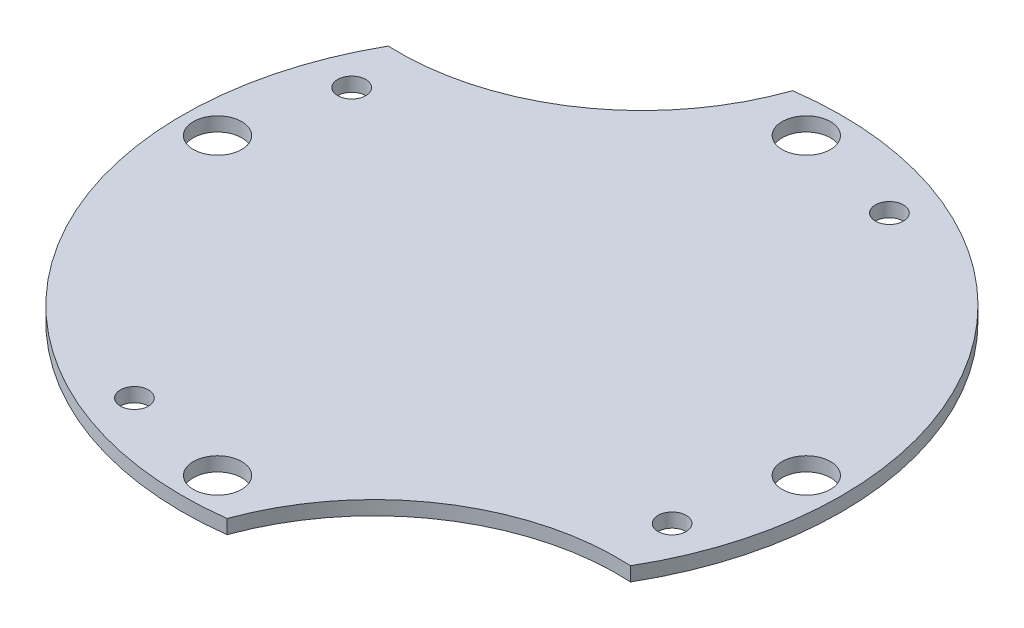
ISO-10303-21;
HEADER;
FILE_DESCRIPTION(('STEP AP214'),'2;1');
FILE_NAME('part.step','',(''),(''),'','','');
FILE_SCHEMA(('AUTOMOTIVE_DESIGN { 1 0 10303 214 1 1 1 1 }'));
ENDSEC;
DATA;
#1=APPLICATION_CONTEXT('core data for automotive mechanical design processes');
#2=APPLICATION_PROTOCOL_DEFINITION('international standard','automotive_design',2000,#1);
#3=PRODUCT_CONTEXT('',#1,'mechanical');
#4=PRODUCT('Part','Part','',(#3));
#5=PRODUCT_RELATED_PRODUCT_CATEGORY('part','',(#4));
#6=PRODUCT_DEFINITION_FORMATION('','',#4);
#7=PRODUCT_DEFINITION_CONTEXT('part definition',#1,'design');
#8=PRODUCT_DEFINITION('design','',#6,#7);
#9=PRODUCT_DEFINITION_SHAPE('','',#8);
#10=(LENGTH_UNIT() NAMED_UNIT(*) SI_UNIT(.MILLI.,.METRE.));
#11=(NAMED_UNIT(*) PLANE_ANGLE_UNIT() SI_UNIT($,.RADIAN.));
#12=(NAMED_UNIT(*) SI_UNIT($,.STERADIAN.) SOLID_ANGLE_UNIT());
#13=UNCERTAINTY_MEASURE_WITH_UNIT(LENGTH_MEASURE(1.E-05),#10,'distance_accuracy_value','');
#14=(GEOMETRIC_REPRESENTATION_CONTEXT(3) GLOBAL_UNCERTAINTY_ASSIGNED_CONTEXT((#13)) GLOBAL_UNIT_ASSIGNED_CONTEXT((#10,
#11,#12)) REPRESENTATION_CONTEXT('',''));
#15=CARTESIAN_POINT('',(0.,0.,0.));
#16=DIRECTION('',(0.,0.,1.));
#17=DIRECTION('',(1.,0.,0.));
#18=AXIS2_PLACEMENT_3D('',#15,#16,#17);
#19=CARTESIAN_POINT('',(9.03512257305145,1.6,-0.496100850031172));
#20=DIRECTION('',(0.,-1.,0.));
#21=DIRECTION('',(0.,0.,-1.));
#22=AXIS2_PLACEMENT_3D('',#19,#20,#21);
#23=CYLINDRICAL_SURFACE('',#22,37.5);
#24=CARTESIAN_POINT('',(9.03512257305145,0.,-0.496100850031172));
#25=DIRECTION('',(0.,1.,0.));
#26=DIRECTION('',(0.,0.,1.));
#27=AXIS2_PLACEMENT_3D('',#24,#25,#26);
#28=CIRCLE('',#27,37.5);
#29=CARTESIAN_POINT('',(41.4282299278979,0.,18.3966648526761));
#30=VERTEX_POINT('',#29);
#31=CARTESIAN_POINT('',(3.83543220498433,0.,-37.63386088044));
#32=VERTEX_POINT('',#31);
#33=EDGE_CURVE('E100',#30,#32,#28,.T.);
#34=ORIENTED_EDGE('',*,*,#33,.T.);
#35=DIRECTION('',(0.,1.,0.));
#36=VECTOR('',#35,1.);
#37=CARTESIAN_POINT('',(3.83543220498434,-3.4,-37.63386088044));
#38=LINE('',#37,#36);
#39=CARTESIAN_POINT('',(3.83543220498433,1.6,-37.63386088044));
#40=VERTEX_POINT('',#39);
#41=EDGE_CURVE('E54',#32,#40,#38,.T.);
#42=ORIENTED_EDGE('',*,*,#41,.T.);
#43=CARTESIAN_POINT('',(9.03512257305145,1.6,-0.496100850031172));
#44=DIRECTION('',(0.,1.,0.));
#45=DIRECTION('',(0.,0.,1.));
#46=AXIS2_PLACEMENT_3D('',#43,#44,#45);
#47=CIRCLE('',#46,37.5);
#48=CARTESIAN_POINT('',(41.4282299278979,1.6,18.3966648526761));
#49=VERTEX_POINT('',#48);
#50=EDGE_CURVE('E99',#49,#40,#47,.T.);
#51=ORIENTED_EDGE('',*,*,#50,.F.);
#52=DIRECTION('',(0.,1.,0.));
#53=VECTOR('',#52,1.);
#54=CARTESIAN_POINT('',(41.4282299278979,-3.4,18.3966648526761));
#55=LINE('',#54,#53);
#56=EDGE_CURVE('E80',#49,#30,#55,.F.);
#57=ORIENTED_EDGE('',*,*,#56,.T.);
#58=EDGE_LOOP('',(#34,#42,#51,#57));
#59=FACE_BOUND('',#58,.T.);
#60=ADVANCED_FACE('F39',(#59),#23,.T.);
#61=CARTESIAN_POINT('',(-23.5667800019792,1.6,-19.0262370742528));
#62=VERTEX_POINT('',#61);
#63=CARTESIAN_POINT('',(13.8200934966106,1.6,36.697367034272));
#64=VERTEX_POINT('',#63);
#65=EDGE_CURVE('E91',#62,#64,#47,.T.);
#66=ORIENTED_EDGE('',*,*,#65,.F.);
#67=DIRECTION('',(0.,1.,0.));
#68=VECTOR('',#67,1.);
#69=CARTESIAN_POINT('',(-23.5667800019792,-3.4,-19.0262370742528));
#70=LINE('',#69,#68);
#71=CARTESIAN_POINT('',(-23.5667800019792,0.,-19.0262370742528));
#72=VERTEX_POINT('',#71);
#73=EDGE_CURVE('E94',#62,#72,#70,.F.);
#74=ORIENTED_EDGE('',*,*,#73,.T.);
#75=CARTESIAN_POINT('',(13.8200934966106,0.,36.697367034272));
#76=VERTEX_POINT('',#75);
#77=EDGE_CURVE('E93',#72,#76,#28,.T.);
#78=ORIENTED_EDGE('',*,*,#77,.T.);
#79=DIRECTION('',(0.,1.,0.));
#80=VECTOR('',#79,1.);
#81=CARTESIAN_POINT('',(13.8200934966106,-3.4,36.697367034272));
#82=LINE('',#81,#80);
#83=EDGE_CURVE('E61',#76,#64,#82,.T.);
#84=ORIENTED_EDGE('',*,*,#83,.T.);
#85=EDGE_LOOP('',(#66,#74,#78,#84));
#86=FACE_BOUND('',#85,.T.);
#87=ADVANCED_FACE('F41',(#86),#23,.T.);
#88=CARTESIAN_POINT('',(9.03512257305145,1.6,-0.496100850031172));
#89=DIRECTION('',(0.,1.,0.));
#90=DIRECTION('',(0.,0.,1.));
#91=AXIS2_PLACEMENT_3D('',#88,#89,#90);
#92=PLANE('',#91);
#93=CARTESIAN_POINT('',(-22.3602061702579,1.6,-46.7299171337358));
#94=DIRECTION('',(0.,1.,0.));
#95=DIRECTION('',(0.,0.,1.));
#96=AXIS2_PLACEMENT_3D('',#93,#94,#95);
#97=CIRCLE('',#96,27.7299424674771);
#98=EDGE_CURVE('E85',#62,#40,#97,.T.);
#99=ORIENTED_EDGE('',*,*,#98,.F.);
#100=ORIENTED_EDGE('',*,*,#65,.T.);
#101=CARTESIAN_POINT('',(39.9126041477574,1.6,46.0851568257714));
#102=DIRECTION('',(0.,1.,0.));
#103=DIRECTION('',(0.,0.,-1.));
#104=AXIS2_PLACEMENT_3D('',#101,#102,#103);
#105=CIRCLE('',#104,27.7299424674771);
#106=EDGE_CURVE('E77',#49,#64,#105,.T.);
#107=ORIENTED_EDGE('',*,*,#106,.F.);
#108=ORIENTED_EDGE('',*,*,#50,.T.);
#109=EDGE_LOOP('',(#99,#100,#107,#108));
#110=FACE_BOUND('',#109,.T.);
#111=CARTESIAN_POINT('',(9.03512257301126,1.6,-33.9910252257756));
#112=DIRECTION('',(0.,1.,0.));
#113=DIRECTION('',(0.,0.,1.));
#114=AXIS2_PLACEMENT_3D('',#111,#112,#113);
#115=CIRCLE('',#114,2.75);
#116=CARTESIAN_POINT('',(9.03512257301126,1.6,-31.2410252257756));
#117=VERTEX_POINT('',#116);
#118=EDGE_CURVE('E150',#117,#117,#115,.T.);
#119=ORIENTED_EDGE('',*,*,#118,.F.);
#120=EDGE_LOOP('',(#119));
#121=FACE_BOUND('',#120,.T.);
#122=CARTESIAN_POINT('',(42.5300469487959,1.6,-0.49610085007125));
#123=DIRECTION('',(0.,1.,0.));
#124=DIRECTION('',(0.,0.,1.));
#125=AXIS2_PLACEMENT_3D('',#122,#123,#124);
#126=CIRCLE('',#125,2.75);
#127=CARTESIAN_POINT('',(42.5300469487959,1.6,2.25389914992875));
#128=VERTEX_POINT('',#127);
#129=EDGE_CURVE('E153',#128,#128,#126,.T.);
#130=ORIENTED_EDGE('',*,*,#129,.F.);
#131=EDGE_LOOP('',(#130));
#132=FACE_BOUND('',#131,.T.);
#133=CARTESIAN_POINT('',(9.03512257309142,1.6,32.9988235257133));
#134=DIRECTION('',(0.,1.,0.));
#135=DIRECTION('',(0.,0.,1.));
#136=AXIS2_PLACEMENT_3D('',#133,#134,#135);
#137=CIRCLE('',#136,2.75);
#138=CARTESIAN_POINT('',(9.03512257309142,1.6,35.7488235257133));
#139=VERTEX_POINT('',#138);
#140=EDGE_CURVE('E156',#139,#139,#137,.T.);
#141=ORIENTED_EDGE('',*,*,#140,.F.);
#142=EDGE_LOOP('',(#141));
#143=FACE_BOUND('',#142,.T.);
#144=CARTESIAN_POINT('',(-3.3268950097145,1.6,30.0946865930768));
#145=DIRECTION('',(0.,1.,0.));
#146=DIRECTION('',(0.,0.,1.));
#147=AXIS2_PLACEMENT_3D('',#144,#145,#146);
#148=CIRCLE('',#147,1.6);
#149=CARTESIAN_POINT('',(-3.3268950097145,1.6,31.6946865930768));
#150=VERTEX_POINT('',#149);
#151=EDGE_CURVE('E144',#150,#150,#148,.T.);
#152=ORIENTED_EDGE('',*,*,#151,.F.);
#153=EDGE_LOOP('',(#152));
#154=FACE_BOUND('',#153,.T.);
#155=CARTESIAN_POINT('',(-21.5556648700565,1.6,-12.8581184327971));
#156=DIRECTION('',(0.,1.,0.));
#157=DIRECTION('',(0.,0.,1.));
#158=AXIS2_PLACEMENT_3D('',#155,#156,#157);
#159=CIRCLE('',#158,1.6);
#160=CARTESIAN_POINT('',(-21.5556648700565,1.6,-11.2581184327971));
#161=VERTEX_POINT('',#160);
#162=EDGE_CURVE('E141',#161,#161,#159,.T.);
#163=ORIENTED_EDGE('',*,*,#162,.F.);
#164=EDGE_LOOP('',(#163));
#165=FACE_BOUND('',#164,.T.);
#166=CARTESIAN_POINT('',(21.3971401558174,1.6,-31.0868882931391));
#167=DIRECTION('',(0.,1.,0.));
#168=DIRECTION('',(0.,0.,1.));
#169=AXIS2_PLACEMENT_3D('',#166,#167,#168);
#170=CIRCLE('',#169,1.6);
#171=CARTESIAN_POINT('',(21.3971401558174,1.6,-29.4868882931392));
#172=VERTEX_POINT('',#171);
#173=EDGE_CURVE('E145',#172,#172,#170,.T.);
#174=ORIENTED_EDGE('',*,*,#173,.F.);
#175=EDGE_LOOP('',(#174));
#176=FACE_BOUND('',#175,.T.);
#177=CARTESIAN_POINT('',(39.6259100161594,1.6,11.8659167327348));
#178=DIRECTION('',(0.,1.,0.));
#179=DIRECTION('',(0.,0.,1.));
#180=AXIS2_PLACEMENT_3D('',#177,#178,#179);
#181=CIRCLE('',#180,1.6);
#182=CARTESIAN_POINT('',(39.6259100161594,1.6,13.4659167327348));
#183=VERTEX_POINT('',#182);
#184=EDGE_CURVE('E140',#183,#183,#181,.T.);
#185=ORIENTED_EDGE('',*,*,#184,.F.);
#186=EDGE_LOOP('',(#185));
#187=FACE_BOUND('',#186,.T.);
#188=CARTESIAN_POINT('',(-24.459801802693,1.6,-0.49610084999086));
#189=DIRECTION('',(0.,1.,0.));
#190=DIRECTION('',(0.,0.,1.));
#191=AXIS2_PLACEMENT_3D('',#188,#189,#190);
#192=CIRCLE('',#191,2.75);
#193=CARTESIAN_POINT('',(-24.459801802693,1.6,2.25389915000914));
#194=VERTEX_POINT('',#193);
#195=EDGE_CURVE('E105',#194,#194,#192,.T.);
#196=ORIENTED_EDGE('',*,*,#195,.F.);
#197=EDGE_LOOP('',(#196));
#198=FACE_BOUND('',#197,.T.);
#199=ADVANCED_FACE('F97',(#110,#121,#132,#143,#154,#165,#176,#187,#198),#92,.T.);
#200=CARTESIAN_POINT('',(9.03512257305145,0.,-0.496100850031172));
#201=DIRECTION('',(0.,1.,0.));
#202=DIRECTION('',(0.,0.,1.));
#203=AXIS2_PLACEMENT_3D('',#200,#201,#202);
#204=PLANE('',#203);
#205=CARTESIAN_POINT('',(9.03512257301126,0.,-33.9910252257756));
#206=DIRECTION('',(0.,1.,0.));
#207=DIRECTION('',(0.,0.,1.));
#208=AXIS2_PLACEMENT_3D('',#205,#206,#207);
#209=CIRCLE('',#208,2.75);
#210=CARTESIAN_POINT('',(9.03512257301126,0.,-31.2410252257756));
#211=VERTEX_POINT('',#210);
#212=EDGE_CURVE('E108',#211,#211,#209,.T.);
#213=ORIENTED_EDGE('',*,*,#212,.T.);
#214=EDGE_LOOP('',(#213));
#215=FACE_BOUND('',#214,.T.);
#216=CARTESIAN_POINT('',(42.5300469487959,0.,-0.49610085007125));
#217=DIRECTION('',(0.,1.,0.));
#218=DIRECTION('',(0.,0.,1.));
#219=AXIS2_PLACEMENT_3D('',#216,#217,#218);
#220=CIRCLE('',#219,2.75);
#221=CARTESIAN_POINT('',(42.5300469487959,0.,2.25389914992875));
#222=VERTEX_POINT('',#221);
#223=EDGE_CURVE('E127',#222,#222,#220,.T.);
#224=ORIENTED_EDGE('',*,*,#223,.T.);
#225=EDGE_LOOP('',(#224));
#226=FACE_BOUND('',#225,.T.);
#227=CARTESIAN_POINT('',(9.03512257309142,0.,32.9988235257133));
#228=DIRECTION('',(0.,1.,0.));
#229=DIRECTION('',(0.,0.,1.));
#230=AXIS2_PLACEMENT_3D('',#227,#228,#229);
#231=CIRCLE('',#230,2.75);
#232=CARTESIAN_POINT('',(9.03512257309142,0.,35.7488235257133));
#233=VERTEX_POINT('',#232);
#234=EDGE_CURVE('E124',#233,#233,#231,.T.);
#235=ORIENTED_EDGE('',*,*,#234,.T.);
#236=EDGE_LOOP('',(#235));
#237=FACE_BOUND('',#236,.T.);
#238=CARTESIAN_POINT('',(-3.3268950097145,0.,30.0946865930768));
#239=DIRECTION('',(0.,1.,0.));
#240=DIRECTION('',(0.,0.,1.));
#241=AXIS2_PLACEMENT_3D('',#238,#239,#240);
#242=CIRCLE('',#241,1.6);
#243=CARTESIAN_POINT('',(-3.3268950097145,0.,31.6946865930768));
#244=VERTEX_POINT('',#243);
#245=EDGE_CURVE('E121',#244,#244,#242,.T.);
#246=ORIENTED_EDGE('',*,*,#245,.T.);
#247=EDGE_LOOP('',(#246));
#248=FACE_BOUND('',#247,.T.);
#249=CARTESIAN_POINT('',(-21.5556648700565,0.,-12.8581184327971));
#250=DIRECTION('',(0.,1.,0.));
#251=DIRECTION('',(0.,0.,1.));
#252=AXIS2_PLACEMENT_3D('',#249,#250,#251);
#253=CIRCLE('',#252,1.6);
#254=CARTESIAN_POINT('',(-21.5556648700565,0.,-11.2581184327971));
#255=VERTEX_POINT('',#254);
#256=EDGE_CURVE('E118',#255,#255,#253,.T.);
#257=ORIENTED_EDGE('',*,*,#256,.T.);
#258=EDGE_LOOP('',(#257));
#259=FACE_BOUND('',#258,.T.);
#260=CARTESIAN_POINT('',(21.3971401558174,0.,-31.0868882931391));
#261=DIRECTION('',(0.,1.,0.));
#262=DIRECTION('',(0.,0.,1.));
#263=AXIS2_PLACEMENT_3D('',#260,#261,#262);
#264=CIRCLE('',#263,1.6);
#265=CARTESIAN_POINT('',(21.3971401558174,0.,-29.4868882931392));
#266=VERTEX_POINT('',#265);
#267=EDGE_CURVE('E115',#266,#266,#264,.T.);
#268=ORIENTED_EDGE('',*,*,#267,.T.);
#269=EDGE_LOOP('',(#268));
#270=FACE_BOUND('',#269,.T.);
#271=CARTESIAN_POINT('',(39.6259100161594,0.,11.8659167327348));
#272=DIRECTION('',(0.,1.,0.));
#273=DIRECTION('',(0.,0.,1.));
#274=AXIS2_PLACEMENT_3D('',#271,#272,#273);
#275=CIRCLE('',#274,1.6);
#276=CARTESIAN_POINT('',(39.6259100161594,0.,13.4659167327348));
#277=VERTEX_POINT('',#276);
#278=EDGE_CURVE('E112',#277,#277,#275,.T.);
#279=ORIENTED_EDGE('',*,*,#278,.T.);
#280=EDGE_LOOP('',(#279));
#281=FACE_BOUND('',#280,.T.);
#282=CARTESIAN_POINT('',(-24.459801802693,0.,-0.49610084999086));
#283=DIRECTION('',(0.,1.,0.));
#284=DIRECTION('',(0.,0.,1.));
#285=AXIS2_PLACEMENT_3D('',#282,#283,#284);
#286=CIRCLE('',#285,2.75);
#287=CARTESIAN_POINT('',(-24.459801802693,0.,2.25389915000914));
#288=VERTEX_POINT('',#287);
#289=EDGE_CURVE('E109',#288,#288,#286,.T.);
#290=ORIENTED_EDGE('',*,*,#289,.T.);
#291=EDGE_LOOP('',(#290));
#292=FACE_BOUND('',#291,.T.);
#293=ORIENTED_EDGE('',*,*,#77,.F.);
#294=CARTESIAN_POINT('',(-22.3602061702579,0.,-46.7299171337358));
#295=DIRECTION('',(0.,1.,0.));
#296=DIRECTION('',(0.,0.,1.));
#297=AXIS2_PLACEMENT_3D('',#294,#295,#296);
#298=CIRCLE('',#297,27.7299424674771);
#299=EDGE_CURVE('E11',#72,#32,#298,.T.);
#300=ORIENTED_EDGE('',*,*,#299,.T.);
#301=ORIENTED_EDGE('',*,*,#33,.F.);
#302=CARTESIAN_POINT('',(39.9126041477574,0.,46.0851568257714));
#303=DIRECTION('',(0.,1.,0.));
#304=DIRECTION('',(0.,0.,1.));
#305=AXIS2_PLACEMENT_3D('',#302,#303,#304);
#306=CIRCLE('',#305,27.7299424674771);
#307=EDGE_CURVE('E47',#30,#76,#306,.T.);
#308=ORIENTED_EDGE('',*,*,#307,.T.);
#309=EDGE_LOOP('',(#293,#300,#301,#308));
#310=FACE_BOUND('',#309,.T.);
#311=ADVANCED_FACE('F133',(#215,#226,#237,#248,#259,#270,#281,#292,#310),#204,.F.);
#312=CARTESIAN_POINT('',(-24.459801802693,-8.4,-0.49610084999086));
#313=DIRECTION('',(0.,1.,0.));
#314=DIRECTION('',(0.,0.,1.));
#315=AXIS2_PLACEMENT_3D('',#312,#313,#314);
#316=CYLINDRICAL_SURFACE('',#315,2.75);
#317=ORIENTED_EDGE('',*,*,#195,.T.);
#318=EDGE_LOOP('',(#317));
#319=FACE_BOUND('',#318,.T.);
#320=ORIENTED_EDGE('',*,*,#289,.F.);
#321=EDGE_LOOP('',(#320));
#322=FACE_BOUND('',#321,.T.);
#323=ADVANCED_FACE('F176',(#319,#322),#316,.F.);
#324=CARTESIAN_POINT('',(39.6259100161594,-8.4,11.8659167327348));
#325=DIRECTION('',(0.,1.,0.));
#326=DIRECTION('',(0.,0.,1.));
#327=AXIS2_PLACEMENT_3D('',#324,#325,#326);
#328=CYLINDRICAL_SURFACE('',#327,1.6);
#329=ORIENTED_EDGE('',*,*,#184,.T.);
#330=EDGE_LOOP('',(#329));
#331=FACE_BOUND('',#330,.T.);
#332=ORIENTED_EDGE('',*,*,#278,.F.);
#333=EDGE_LOOP('',(#332));
#334=FACE_BOUND('',#333,.T.);
#335=ADVANCED_FACE('F179',(#331,#334),#328,.F.);
#336=CARTESIAN_POINT('',(21.3971401558174,-8.4,-31.0868882931391));
#337=DIRECTION('',(0.,1.,0.));
#338=DIRECTION('',(0.,0.,1.));
#339=AXIS2_PLACEMENT_3D('',#336,#337,#338);
#340=CYLINDRICAL_SURFACE('',#339,1.6);
#341=ORIENTED_EDGE('',*,*,#173,.T.);
#342=EDGE_LOOP('',(#341));
#343=FACE_BOUND('',#342,.T.);
#344=ORIENTED_EDGE('',*,*,#267,.F.);
#345=EDGE_LOOP('',(#344));
#346=FACE_BOUND('',#345,.T.);
#347=ADVANCED_FACE('F221',(#343,#346),#340,.F.);
#348=CARTESIAN_POINT('',(-21.5556648700565,-8.4,-12.8581184327971));
#349=DIRECTION('',(0.,1.,0.));
#350=DIRECTION('',(0.,0.,1.));
#351=AXIS2_PLACEMENT_3D('',#348,#349,#350);
#352=CYLINDRICAL_SURFACE('',#351,1.6);
#353=ORIENTED_EDGE('',*,*,#162,.T.);
#354=EDGE_LOOP('',(#353));
#355=FACE_BOUND('',#354,.T.);
#356=ORIENTED_EDGE('',*,*,#256,.F.);
#357=EDGE_LOOP('',(#356));
#358=FACE_BOUND('',#357,.T.);
#359=ADVANCED_FACE('F231',(#355,#358),#352,.F.);
#360=CARTESIAN_POINT('',(-3.3268950097145,-8.4,30.0946865930768));
#361=DIRECTION('',(0.,1.,0.));
#362=DIRECTION('',(0.,0.,1.));
#363=AXIS2_PLACEMENT_3D('',#360,#361,#362);
#364=CYLINDRICAL_SURFACE('',#363,1.6);
#365=ORIENTED_EDGE('',*,*,#151,.T.);
#366=EDGE_LOOP('',(#365));
#367=FACE_BOUND('',#366,.T.);
#368=ORIENTED_EDGE('',*,*,#245,.F.);
#369=EDGE_LOOP('',(#368));
#370=FACE_BOUND('',#369,.T.);
#371=ADVANCED_FACE('F161',(#367,#370),#364,.F.);
#372=CARTESIAN_POINT('',(9.03512257309142,-8.4,32.9988235257133));
#373=DIRECTION('',(0.,1.,0.));
#374=DIRECTION('',(0.,0.,1.));
#375=AXIS2_PLACEMENT_3D('',#372,#373,#374);
#376=CYLINDRICAL_SURFACE('',#375,2.75);
#377=ORIENTED_EDGE('',*,*,#140,.T.);
#378=EDGE_LOOP('',(#377));
#379=FACE_BOUND('',#378,.T.);
#380=ORIENTED_EDGE('',*,*,#234,.F.);
#381=EDGE_LOOP('',(#380));
#382=FACE_BOUND('',#381,.T.);
#383=ADVANCED_FACE('F250',(#379,#382),#376,.F.);
#384=CARTESIAN_POINT('',(42.5300469487959,-8.4,-0.49610085007125));
#385=DIRECTION('',(0.,1.,0.));
#386=DIRECTION('',(0.,0.,1.));
#387=AXIS2_PLACEMENT_3D('',#384,#385,#386);
#388=CYLINDRICAL_SURFACE('',#387,2.75);
#389=ORIENTED_EDGE('',*,*,#129,.T.);
#390=EDGE_LOOP('',(#389));
#391=FACE_BOUND('',#390,.T.);
#392=ORIENTED_EDGE('',*,*,#223,.F.);
#393=EDGE_LOOP('',(#392));
#394=FACE_BOUND('',#393,.T.);
#395=ADVANCED_FACE('F259',(#391,#394),#388,.F.);
#396=CARTESIAN_POINT('',(9.03512257301126,-8.4,-33.9910252257756));
#397=DIRECTION('',(0.,1.,0.));
#398=DIRECTION('',(0.,0.,1.));
#399=AXIS2_PLACEMENT_3D('',#396,#397,#398);
#400=CYLINDRICAL_SURFACE('',#399,2.75);
#401=ORIENTED_EDGE('',*,*,#118,.T.);
#402=EDGE_LOOP('',(#401));
#403=FACE_BOUND('',#402,.T.);
#404=ORIENTED_EDGE('',*,*,#212,.F.);
#405=EDGE_LOOP('',(#404));
#406=FACE_BOUND('',#405,.T.);
#407=ADVANCED_FACE('F269',(#403,#406),#400,.F.);
#408=CARTESIAN_POINT('',(39.9126041477574,-8.4,46.0851568257714));
#409=DIRECTION('',(0.,1.,0.));
#410=DIRECTION('',(0.,0.,1.));
#411=AXIS2_PLACEMENT_3D('',#408,#409,#410);
#412=CYLINDRICAL_SURFACE('',#411,27.7299424674771);
#413=ORIENTED_EDGE('',*,*,#307,.F.);
#414=ORIENTED_EDGE('',*,*,#56,.F.);
#415=ORIENTED_EDGE('',*,*,#106,.T.);
#416=ORIENTED_EDGE('',*,*,#83,.F.);
#417=EDGE_LOOP('',(#413,#414,#415,#416));
#418=FACE_BOUND('',#417,.T.);
#419=ADVANCED_FACE('F78',(#418),#412,.F.);
#420=CARTESIAN_POINT('',(-22.3602061702579,-8.4,-46.7299171337358));
#421=DIRECTION('',(0.,1.,0.));
#422=DIRECTION('',(0.,0.,1.));
#423=AXIS2_PLACEMENT_3D('',#420,#421,#422);
#424=CYLINDRICAL_SURFACE('',#423,27.7299424674771);
#425=ORIENTED_EDGE('',*,*,#299,.F.);
#426=ORIENTED_EDGE('',*,*,#73,.F.);
#427=ORIENTED_EDGE('',*,*,#98,.T.);
#428=ORIENTED_EDGE('',*,*,#41,.F.);
#429=EDGE_LOOP('',(#425,#426,#427,#428));
#430=FACE_BOUND('',#429,.T.);
#431=ADVANCED_FACE('F290',(#430),#424,.F.);
#432=CLOSED_SHELL('',(#60,#87,#199,#311,#323,#335,#347,#359,#371,#383,#395,#407,#419,#431));
#433=MANIFOLD_SOLID_BREP('B2',#432);
#434=ADVANCED_BREP_SHAPE_REPRESENTATION('',(#18,#433),#14);
#435=SHAPE_DEFINITION_REPRESENTATION(#9,#434);
ENDSEC;
END-ISO-10303-21;
